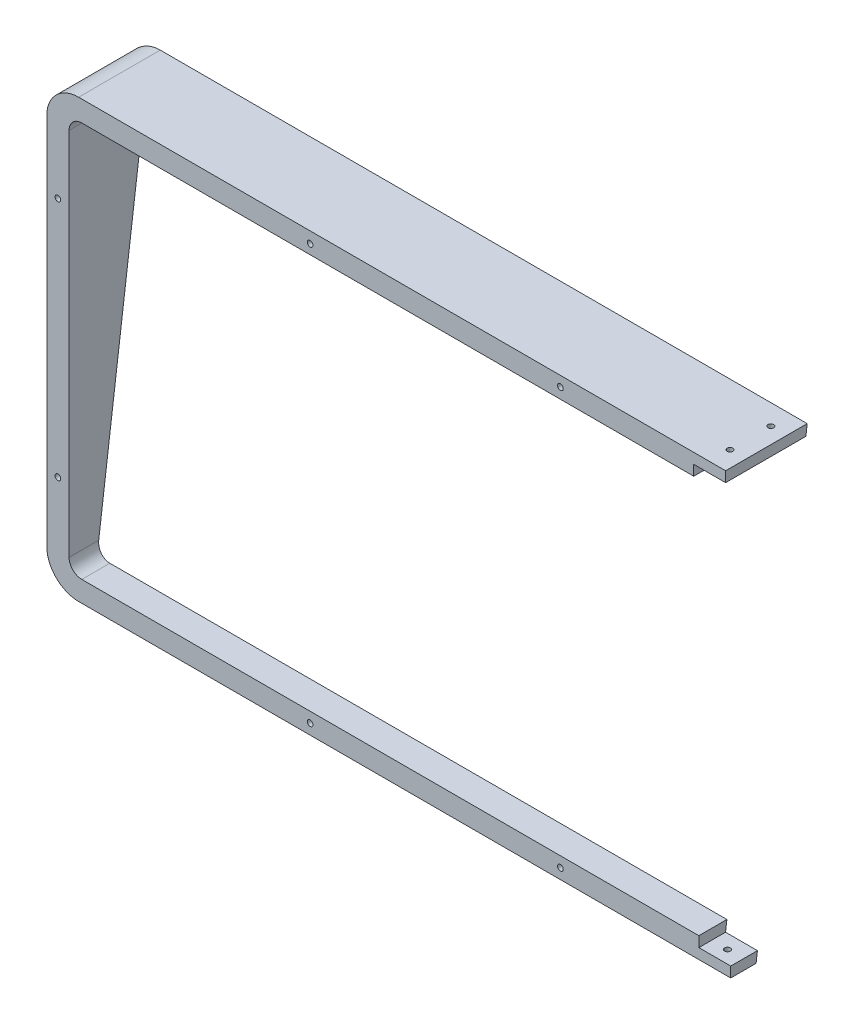
ISO-10303-21;
HEADER;
FILE_DESCRIPTION(('STEP AP214'),'2;1');
FILE_NAME('part.step','',(''),(''),'','','');
FILE_SCHEMA(('AUTOMOTIVE_DESIGN { 1 0 10303 214 1 1 1 1 }'));
ENDSEC;
DATA;
#1=APPLICATION_CONTEXT('core data for automotive mechanical design processes');
#2=APPLICATION_PROTOCOL_DEFINITION('international standard','automotive_design',2000,#1);
#3=PRODUCT_CONTEXT('',#1,'mechanical');
#4=PRODUCT('Part','Part','',(#3));
#5=PRODUCT_RELATED_PRODUCT_CATEGORY('part','',(#4));
#6=PRODUCT_DEFINITION_FORMATION('','',#4);
#7=PRODUCT_DEFINITION_CONTEXT('part definition',#1,'design');
#8=PRODUCT_DEFINITION('design','',#6,#7);
#9=PRODUCT_DEFINITION_SHAPE('','',#8);
#10=(LENGTH_UNIT() NAMED_UNIT(*) SI_UNIT(.MILLI.,.METRE.));
#11=(NAMED_UNIT(*) PLANE_ANGLE_UNIT() SI_UNIT($,.RADIAN.));
#12=(NAMED_UNIT(*) SI_UNIT($,.STERADIAN.) SOLID_ANGLE_UNIT());
#13=UNCERTAINTY_MEASURE_WITH_UNIT(LENGTH_MEASURE(1.E-05),#10,'distance_accuracy_value','');
#14=(GEOMETRIC_REPRESENTATION_CONTEXT(3) GLOBAL_UNCERTAINTY_ASSIGNED_CONTEXT((#13)) GLOBAL_UNIT_ASSIGNED_CONTEXT((#10,
#11,#12)) REPRESENTATION_CONTEXT('',''));
#15=CARTESIAN_POINT('',(0.,0.,0.));
#16=DIRECTION('',(0.,0.,1.));
#17=DIRECTION('',(1.,0.,0.));
#18=AXIS2_PLACEMENT_3D('',#15,#16,#17);
#19=CARTESIAN_POINT('',(221.699809919039,-32.9124999999699,-25.6100000004634));
#20=DIRECTION('',(0.,1.,0.));
#21=DIRECTION('',(0.,0.,1.));
#22=AXIS2_PLACEMENT_3D('',#19,#20,#21);
#23=PLANE('',#22);
#24=DIRECTION('',(1.,0.,0.));
#25=VECTOR('',#24,1.);
#26=CARTESIAN_POINT('',(1008.75625,-32.9124999999699,-25.181428383529));
#27=LINE('',#26,#25);
#28=CARTESIAN_POINT('',(211.699809919039,-32.9124999999699,-25.181428383529));
#29=VERTEX_POINT('',#28);
#30=CARTESIAN_POINT('',(221.699809919039,-32.9124999999699,-25.181428383529));
#31=VERTEX_POINT('',#30);
#32=EDGE_CURVE('E312',#29,#31,#27,.T.);
#33=ORIENTED_EDGE('',*,*,#32,.T.);
#34=DIRECTION('',(0.,0.,1.));
#35=VECTOR('',#34,1.);
#36=CARTESIAN_POINT('',(221.699809919039,-32.9124999999699,-25.6100000004634));
#37=LINE('',#36,#35);
#38=CARTESIAN_POINT('',(221.699809919039,-32.9124999999699,0.));
#39=VERTEX_POINT('',#38);
#40=EDGE_CURVE('E303',#31,#39,#37,.T.);
#41=ORIENTED_EDGE('',*,*,#40,.T.);
#42=DIRECTION('',(1.,0.,0.));
#43=VECTOR('',#42,1.);
#44=CARTESIAN_POINT('',(8.7462499999999,-32.9124999999699,0.));
#45=LINE('',#44,#43);
#46=CARTESIAN_POINT('',(211.699809919039,-32.9124999999699,0.));
#47=VERTEX_POINT('',#46);
#48=EDGE_CURVE('E330',#47,#39,#45,.T.);
#49=ORIENTED_EDGE('',*,*,#48,.F.);
#50=DIRECTION('',(0.,0.,1.));
#51=VECTOR('',#50,1.);
#52=CARTESIAN_POINT('',(211.699809919039,-32.9124999999699,-25.6100000004634));
#53=LINE('',#52,#51);
#54=EDGE_CURVE('E340',#29,#47,#53,.T.);
#55=ORIENTED_EDGE('',*,*,#54,.F.);
#56=EDGE_LOOP('',(#33,#41,#49,#55));
#57=FACE_BOUND('',#56,.T.);
#58=CARTESIAN_POINT('',(216.69375,-32.9124999999699,-19.2));
#59=DIRECTION('',(0.,1.,0.));
#60=DIRECTION('',(0.,0.,1.));
#61=AXIS2_PLACEMENT_3D('',#58,#59,#60);
#62=CIRCLE('',#61,0.889000000000001);
#63=CARTESIAN_POINT('',(216.69375,-32.9124999999699,-18.311));
#64=VERTEX_POINT('',#63);
#65=EDGE_CURVE('E295',#64,#64,#62,.F.);
#66=ORIENTED_EDGE('',*,*,#65,.F.);
#67=EDGE_LOOP('',(#66));
#68=FACE_BOUND('',#67,.T.);
#69=CARTESIAN_POINT('',(216.69375,-32.9124999999699,-6.4));
#70=DIRECTION('',(0.,1.,0.));
#71=DIRECTION('',(0.,0.,1.));
#72=AXIS2_PLACEMENT_3D('',#69,#70,#71);
#73=CIRCLE('',#72,0.889000000000001);
#74=CARTESIAN_POINT('',(216.69375,-32.9124999999699,-5.511));
#75=VERTEX_POINT('',#74);
#76=EDGE_CURVE('E300',#75,#75,#73,.F.);
#77=ORIENTED_EDGE('',*,*,#76,.F.);
#78=EDGE_LOOP('',(#77));
#79=FACE_BOUND('',#78,.T.);
#80=ADVANCED_FACE('F46',(#57,#68,#79),#23,.F.);
#81=CARTESIAN_POINT('',(221.699809919039,-27.3507461540696,-25.6100000004634));
#82=DIRECTION('',(-1.,0.,0.));
#83=DIRECTION('',(0.,0.,1.));
#84=AXIS2_PLACEMENT_3D('',#81,#82,#83);
#85=PLANE('',#84);
#86=DIRECTION('',(0.,0.,1.));
#87=VECTOR('',#86,1.);
#88=CARTESIAN_POINT('',(221.699809919039,-29.6624999999703,0.));
#89=LINE('',#88,#87);
#90=CARTESIAN_POINT('',(221.699809919039,-29.6624999999703,-25.6));
#91=VERTEX_POINT('',#90);
#92=CARTESIAN_POINT('',(221.699809919039,-29.6624999999703,0.));
#93=VERTEX_POINT('',#92);
#94=EDGE_CURVE('E50',#91,#93,#89,.T.);
#95=ORIENTED_EDGE('',*,*,#94,.T.);
#96=DIRECTION('',(0.,1.,0.));
#97=VECTOR('',#96,1.);
#98=CARTESIAN_POINT('',(221.699809919039,-181.504202820948,0.));
#99=LINE('',#98,#97);
#100=EDGE_CURVE('E333',#39,#93,#99,.T.);
#101=ORIENTED_EDGE('',*,*,#100,.F.);
#102=ORIENTED_EDGE('',*,*,#40,.F.);
#103=DIRECTION('',(0.,0.99180817463833,-0.127736231041094));
#104=VECTOR('',#103,1.);
#105=CARTESIAN_POINT('',(221.699809919039,-3.7272493642608,-28.9402337790932));
#106=LINE('',#105,#104);
#107=EDGE_CURVE('E72',#31,#91,#106,.T.);
#108=ORIENTED_EDGE('',*,*,#107,.T.);
#109=EDGE_LOOP('',(#95,#101,#102,#108));
#110=FACE_BOUND('',#109,.T.);
#111=ADVANCED_FACE('F48',(#110),#85,.F.);
#112=CARTESIAN_POINT('',(211.699809919039,-32.9124999999699,-25.6100000004634));
#113=DIRECTION('',(-1.,0.,0.));
#114=DIRECTION('',(0.,0.,1.));
#115=AXIS2_PLACEMENT_3D('',#112,#113,#114);
#116=PLANE('',#115);
#117=DIRECTION('',(0.,0.,-1.));
#118=VECTOR('',#117,1.);
#119=CARTESIAN_POINT('',(211.699809919039,-36.1625000000006,-25.6));
#120=LINE('',#119,#118);
#121=CARTESIAN_POINT('',(211.699809919039,-36.1625000000006,0.));
#122=VERTEX_POINT('',#121);
#123=CARTESIAN_POINT('',(211.699809919039,-36.1625000000006,-24.7628567670581));
#124=VERTEX_POINT('',#123);
#125=EDGE_CURVE('E359',#122,#124,#120,.T.);
#126=ORIENTED_EDGE('',*,*,#125,.T.);
#127=DIRECTION('',(0.,0.99180817463833,-0.127736231041094));
#128=VECTOR('',#127,1.);
#129=CARTESIAN_POINT('',(211.699809919039,-3.7272493642608,-28.9402337790932));
#130=LINE('',#129,#128);
#131=EDGE_CURVE('E308',#124,#29,#130,.T.);
#132=ORIENTED_EDGE('',*,*,#131,.T.);
#133=ORIENTED_EDGE('',*,*,#54,.T.);
#134=DIRECTION('',(0.,1.,0.));
#135=VECTOR('',#134,1.);
#136=CARTESIAN_POINT('',(211.699809919039,-181.504202820948,0.));
#137=LINE('',#136,#135);
#138=EDGE_CURVE('E326',#122,#47,#137,.T.);
#139=ORIENTED_EDGE('',*,*,#138,.F.);
#140=EDGE_LOOP('',(#126,#132,#133,#139));
#141=FACE_BOUND('',#140,.T.);
#142=ADVANCED_FACE('F426',(#141),#116,.F.);
#143=CARTESIAN_POINT('',(223.307280219127,-163.4125,-25.6100000004634));
#144=DIRECTION('',(-1.,0.,0.));
#145=DIRECTION('',(0.,0.,1.));
#146=AXIS2_PLACEMENT_3D('',#143,#144,#145);
#147=PLANE('',#146);
#148=DIRECTION('',(0.,0.,-1.));
#149=VECTOR('',#148,1.);
#150=CARTESIAN_POINT('',(223.307280219127,-166.6625,0.));
#151=LINE('',#150,#149);
#152=CARTESIAN_POINT('',(223.307280219127,-166.6625,0.));
#153=VERTEX_POINT('',#152);
#154=CARTESIAN_POINT('',(223.307280219126,-166.6625,-7.95559647507533));
#155=VERTEX_POINT('',#154);
#156=EDGE_CURVE('E315',#153,#155,#151,.T.);
#157=ORIENTED_EDGE('',*,*,#156,.T.);
#158=DIRECTION('',(0.,0.99180817463833,-0.127736231041094));
#159=VECTOR('',#158,1.);
#160=CARTESIAN_POINT('',(223.307280219126,-3.7272493642608,-28.9402337790932));
#161=LINE('',#160,#159);
#162=CARTESIAN_POINT('',(223.307280219126,-163.4125,-8.37416809154234));
#163=VERTEX_POINT('',#162);
#164=EDGE_CURVE('E64',#155,#163,#161,.T.);
#165=ORIENTED_EDGE('',*,*,#164,.T.);
#166=DIRECTION('',(0.,0.,1.));
#167=VECTOR('',#166,1.);
#168=CARTESIAN_POINT('',(223.307280219127,-163.4125,-25.6100000004634));
#169=LINE('',#168,#167);
#170=CARTESIAN_POINT('',(223.307280219127,-163.4125,0.));
#171=VERTEX_POINT('',#170);
#172=EDGE_CURVE('E12',#163,#171,#169,.T.);
#173=ORIENTED_EDGE('',*,*,#172,.T.);
#174=DIRECTION('',(0.,1.,0.));
#175=VECTOR('',#174,1.);
#176=CARTESIAN_POINT('',(223.307280219127,-181.504202820948,0.));
#177=LINE('',#176,#175);
#178=EDGE_CURVE('E316',#153,#171,#177,.T.);
#179=ORIENTED_EDGE('',*,*,#178,.F.);
#180=EDGE_LOOP('',(#157,#165,#173,#179));
#181=FACE_BOUND('',#180,.T.);
#182=ADVANCED_FACE('F484',(#181),#147,.F.);
#183=CARTESIAN_POINT('',(213.307280219127,-128.439696427491,-25.6100000004634));
#184=DIRECTION('',(-1.,0.,0.));
#185=DIRECTION('',(0.,0.,1.));
#186=AXIS2_PLACEMENT_3D('',#183,#184,#185);
#187=PLANE('',#186);
#188=DIRECTION('',(0.,0.,1.));
#189=VECTOR('',#188,1.);
#190=CARTESIAN_POINT('',(213.307280219127,-160.1625,-25.6));
#191=LINE('',#190,#189);
#192=CARTESIAN_POINT('',(213.307280219126,-160.1625,-8.79273970800934));
#193=VERTEX_POINT('',#192);
#194=CARTESIAN_POINT('',(213.307280219127,-160.1625,0.));
#195=VERTEX_POINT('',#194);
#196=EDGE_CURVE('E335',#193,#195,#191,.T.);
#197=ORIENTED_EDGE('',*,*,#196,.T.);
#198=DIRECTION('',(0.,1.,0.));
#199=VECTOR('',#198,1.);
#200=CARTESIAN_POINT('',(213.307280219127,-181.504202820948,0.));
#201=LINE('',#200,#199);
#202=CARTESIAN_POINT('',(213.307280219127,-163.4125,0.));
#203=VERTEX_POINT('',#202);
#204=EDGE_CURVE('E323',#203,#195,#201,.T.);
#205=ORIENTED_EDGE('',*,*,#204,.F.);
#206=DIRECTION('',(0.,0.,1.));
#207=VECTOR('',#206,1.);
#208=CARTESIAN_POINT('',(213.307280219127,-163.4125,-25.6100000004634));
#209=LINE('',#208,#207);
#210=CARTESIAN_POINT('',(213.307280219127,-163.4125,-8.37416809154234));
#211=VERTEX_POINT('',#210);
#212=EDGE_CURVE('E56',#211,#203,#209,.T.);
#213=ORIENTED_EDGE('',*,*,#212,.F.);
#214=DIRECTION('',(0.,0.99180817463833,-0.127736231041094));
#215=VECTOR('',#214,1.);
#216=CARTESIAN_POINT('',(213.307280219126,-3.7272493642608,-28.9402337790932));
#217=LINE('',#216,#215);
#218=EDGE_CURVE('E305',#211,#193,#217,.T.);
#219=ORIENTED_EDGE('',*,*,#218,.T.);
#220=EDGE_LOOP('',(#197,#205,#213,#219));
#221=FACE_BOUND('',#220,.T.);
#222=ADVANCED_FACE('F485',(#221),#187,.F.);
#223=CARTESIAN_POINT('',(213.307280219127,-163.4125,-25.6100000004634));
#224=DIRECTION('',(0.,-1.,0.));
#225=DIRECTION('',(0.,0.,-1.));
#226=AXIS2_PLACEMENT_3D('',#223,#224,#225);
#227=PLANE('',#226);
#228=DIRECTION('',(-1.,0.,0.));
#229=VECTOR('',#228,1.);
#230=CARTESIAN_POINT('',(1008.75625,-163.4125,-8.37416809154233));
#231=LINE('',#230,#229);
#232=EDGE_CURVE('E304',#163,#211,#231,.T.);
#233=ORIENTED_EDGE('',*,*,#232,.T.);
#234=ORIENTED_EDGE('',*,*,#212,.T.);
#235=DIRECTION('',(-1.,0.,0.));
#236=VECTOR('',#235,1.);
#237=CARTESIAN_POINT('',(8.7462499999999,-163.4125,0.));
#238=LINE('',#237,#236);
#239=EDGE_CURVE('E319',#171,#203,#238,.T.);
#240=ORIENTED_EDGE('',*,*,#239,.F.);
#241=ORIENTED_EDGE('',*,*,#172,.F.);
#242=EDGE_LOOP('',(#233,#234,#240,#241));
#243=FACE_BOUND('',#242,.T.);
#244=CARTESIAN_POINT('',(218.307280219127,-163.4125,-3.97779823753767));
#245=DIRECTION('',(0.,-1.,0.));
#246=DIRECTION('',(0.,0.,-1.));
#247=AXIS2_PLACEMENT_3D('',#244,#245,#246);
#248=CIRCLE('',#247,0.889000000000001);
#249=CARTESIAN_POINT('',(218.307280219127,-163.4125,-4.86679823753767));
#250=VERTEX_POINT('',#249);
#251=EDGE_CURVE('E291',#250,#250,#248,.F.);
#252=ORIENTED_EDGE('',*,*,#251,.F.);
#253=EDGE_LOOP('',(#252));
#254=FACE_BOUND('',#253,.T.);
#255=ADVANCED_FACE('F488',(#243,#254),#227,.F.);
#256=CARTESIAN_POINT('',(169.879428114565,-32.844620329947,-4.67));
#257=DIRECTION('',(0.,0.,1.));
#258=DIRECTION('',(1.,0.,0.));
#259=AXIS2_PLACEMENT_3D('',#256,#257,#258);
#260=CONICAL_SURFACE('',#259,0.889000000000001,1.02974425867666);
#261=CARTESIAN_POINT('',(169.879428114565,-32.844620329947,-5.20416509031549));
#262=VERTEX_POINT('',#261);
#263=VERTEX_LOOP('',#262);
#264=FACE_BOUND('',#263,.T.);
#265=CARTESIAN_POINT('',(169.879428114565,-32.844620329947,-4.67));
#266=DIRECTION('',(0.,0.,1.));
#267=DIRECTION('',(1.,0.,0.));
#268=AXIS2_PLACEMENT_3D('',#265,#266,#267);
#269=CIRCLE('',#268,0.889000000000001);
#270=CARTESIAN_POINT('',(170.768428114565,-32.844620329947,-4.67));
#271=VERTEX_POINT('',#270);
#272=EDGE_CURVE('E410',#271,#271,#269,.T.);
#273=ORIENTED_EDGE('',*,*,#272,.T.);
#274=EDGE_LOOP('',(#273));
#275=FACE_BOUND('',#274,.T.);
#276=ADVANCED_FACE('F492',(#264,#275),#260,.F.);
#277=CARTESIAN_POINT('',(12.2499790870042,-60.4171979564535,-4.67));
#278=DIRECTION('',(0.,0.,1.));
#279=DIRECTION('',(1.,0.,0.));
#280=AXIS2_PLACEMENT_3D('',#277,#278,#279);
#281=CONICAL_SURFACE('',#280,0.888999999999987,1.02974425867665);
#282=CARTESIAN_POINT('',(12.2499790870042,-60.4171979564535,-5.20416509031549));
#283=VERTEX_POINT('',#282);
#284=VERTEX_LOOP('',#283);
#285=FACE_BOUND('',#284,.T.);
#286=CARTESIAN_POINT('',(12.2499790870042,-60.4171979564535,-4.67));
#287=DIRECTION('',(0.,0.,1.));
#288=DIRECTION('',(1.,0.,0.));
#289=AXIS2_PLACEMENT_3D('',#286,#287,#288);
#290=CIRCLE('',#289,0.888999999999987);
#291=CARTESIAN_POINT('',(13.1389790870042,-60.4171979564535,-4.67));
#292=VERTEX_POINT('',#291);
#293=EDGE_CURVE('E402',#292,#292,#290,.T.);
#294=ORIENTED_EDGE('',*,*,#293,.T.);
#295=EDGE_LOOP('',(#294));
#296=FACE_BOUND('',#295,.T.);
#297=ADVANCED_FACE('F545',(#285,#296),#281,.F.);
#298=CARTESIAN_POINT('',(91.3575968195982,-163.4125,-4.67));
#299=DIRECTION('',(0.,0.,1.));
#300=DIRECTION('',(1.,0.,0.));
#301=AXIS2_PLACEMENT_3D('',#298,#299,#300);
#302=CONICAL_SURFACE('',#301,0.888999999999987,1.02974425867665);
#303=CARTESIAN_POINT('',(91.3575968195982,-163.4125,-5.20416509031549));
#304=VERTEX_POINT('',#303);
#305=VERTEX_LOOP('',#304);
#306=FACE_BOUND('',#305,.T.);
#307=CARTESIAN_POINT('',(91.3575968195982,-163.4125,-4.67));
#308=DIRECTION('',(0.,0.,1.));
#309=DIRECTION('',(1.,0.,0.));
#310=AXIS2_PLACEMENT_3D('',#307,#308,#309);
#311=CIRCLE('',#310,0.888999999999987);
#312=CARTESIAN_POINT('',(92.2465968195982,-163.4125,-4.67));
#313=VERTEX_POINT('',#312);
#314=EDGE_CURVE('E394',#313,#313,#311,.T.);
#315=ORIENTED_EDGE('',*,*,#314,.T.);
#316=EDGE_LOOP('',(#315));
#317=FACE_BOUND('',#316,.T.);
#318=ADVANCED_FACE('F537',(#306,#317),#302,.F.);
#319=CARTESIAN_POINT('',(169.879428114565,-163.4125,-4.67));
#320=DIRECTION('',(0.,0.,1.));
#321=DIRECTION('',(1.,0.,0.));
#322=AXIS2_PLACEMENT_3D('',#319,#320,#321);
#323=CONICAL_SURFACE('',#322,0.889000000000001,1.02974425867666);
#324=CARTESIAN_POINT('',(169.879428114565,-163.4125,-5.20416509031549));
#325=VERTEX_POINT('',#324);
#326=VERTEX_LOOP('',#325);
#327=FACE_BOUND('',#326,.T.);
#328=CARTESIAN_POINT('',(169.879428114565,-163.4125,-4.67));
#329=DIRECTION('',(0.,0.,1.));
#330=DIRECTION('',(1.,0.,0.));
#331=AXIS2_PLACEMENT_3D('',#328,#329,#330);
#332=CIRCLE('',#331,0.889000000000001);
#333=CARTESIAN_POINT('',(170.768428114565,-163.4125,-4.67));
#334=VERTEX_POINT('',#333);
#335=EDGE_CURVE('E390',#334,#334,#332,.T.);
#336=ORIENTED_EDGE('',*,*,#335,.T.);
#337=EDGE_LOOP('',(#336));
#338=FACE_BOUND('',#337,.T.);
#339=ADVANCED_FACE('F533',(#327,#338),#323,.F.);
#340=CARTESIAN_POINT('',(12.2499790870042,-136.153038312332,-4.67));
#341=DIRECTION('',(0.,0.,1.));
#342=DIRECTION('',(1.,0.,0.));
#343=AXIS2_PLACEMENT_3D('',#340,#341,#342);
#344=CONICAL_SURFACE('',#343,0.888999999999987,1.02974425867665);
#345=CARTESIAN_POINT('',(12.2499790870042,-136.153038312332,-5.20416509031549));
#346=VERTEX_POINT('',#345);
#347=VERTEX_LOOP('',#346);
#348=FACE_BOUND('',#347,.T.);
#349=CARTESIAN_POINT('',(12.2499790870042,-136.153038312332,-4.67));
#350=DIRECTION('',(0.,0.,1.));
#351=DIRECTION('',(1.,0.,0.));
#352=AXIS2_PLACEMENT_3D('',#349,#350,#351);
#353=CIRCLE('',#352,0.888999999999987);
#354=CARTESIAN_POINT('',(13.1389790870042,-136.153038312332,-4.67));
#355=VERTEX_POINT('',#354);
#356=EDGE_CURVE('E398',#355,#355,#353,.T.);
#357=ORIENTED_EDGE('',*,*,#356,.T.);
#358=EDGE_LOOP('',(#357));
#359=FACE_BOUND('',#358,.T.);
#360=ADVANCED_FACE('F536',(#348,#359),#344,.F.);
#361=CARTESIAN_POINT('',(91.3575968195982,-33.1714533837719,-4.67));
#362=DIRECTION('',(0.,0.,1.));
#363=DIRECTION('',(1.,0.,0.));
#364=AXIS2_PLACEMENT_3D('',#361,#362,#363);
#365=CONICAL_SURFACE('',#364,0.888999999999987,1.02974425867665);
#366=CARTESIAN_POINT('',(91.3575968195982,-33.1714533837719,-5.20416509031549));
#367=VERTEX_POINT('',#366);
#368=VERTEX_LOOP('',#367);
#369=FACE_BOUND('',#368,.T.);
#370=CARTESIAN_POINT('',(91.3575968195982,-33.1714533837719,-4.67));
#371=DIRECTION('',(0.,0.,1.));
#372=DIRECTION('',(1.,0.,0.));
#373=AXIS2_PLACEMENT_3D('',#370,#371,#372);
#374=CIRCLE('',#373,0.888999999999987);
#375=CARTESIAN_POINT('',(92.2465968195982,-33.1714533837719,-4.67));
#376=VERTEX_POINT('',#375);
#377=EDGE_CURVE('E406',#376,#376,#374,.T.);
#378=ORIENTED_EDGE('',*,*,#377,.T.);
#379=EDGE_LOOP('',(#378));
#380=FACE_BOUND('',#379,.T.);
#381=ADVANCED_FACE('F552',(#369,#380),#365,.F.);
#382=CARTESIAN_POINT('',(169.879428114565,-32.844620329947,1.56));
#383=DIRECTION('',(0.,0.,1.));
#384=DIRECTION('',(1.,0.,0.));
#385=AXIS2_PLACEMENT_3D('',#382,#383,#384);
#386=CYLINDRICAL_SURFACE('',#385,0.889000000000001);
#387=CARTESIAN_POINT('',(169.879428114565,-32.844620329947,0.));
#388=DIRECTION('',(0.,0.,-1.));
#389=DIRECTION('',(-1.,0.,0.));
#390=AXIS2_PLACEMENT_3D('',#387,#388,#389);
#391=CIRCLE('',#390,0.889000000000001);
#392=CARTESIAN_POINT('',(168.990428114565,-32.844620329947,0.));
#393=VERTEX_POINT('',#392);
#394=EDGE_CURVE('E257',#393,#393,#391,.F.);
#395=ORIENTED_EDGE('',*,*,#394,.T.);
#396=EDGE_LOOP('',(#395));
#397=FACE_BOUND('',#396,.T.);
#398=ORIENTED_EDGE('',*,*,#272,.F.);
#399=EDGE_LOOP('',(#398));
#400=FACE_BOUND('',#399,.T.);
#401=ADVANCED_FACE('F556',(#397,#400),#386,.F.);
#402=CARTESIAN_POINT('',(12.2499790870042,-60.4171979564535,1.56));
#403=DIRECTION('',(0.,0.,1.));
#404=DIRECTION('',(1.,0.,0.));
#405=AXIS2_PLACEMENT_3D('',#402,#403,#404);
#406=CYLINDRICAL_SURFACE('',#405,0.888999999999988);
#407=CARTESIAN_POINT('',(12.2499790870042,-60.4171979564535,0.));
#408=DIRECTION('',(0.,0.,-1.));
#409=DIRECTION('',(-1.,0.,0.));
#410=AXIS2_PLACEMENT_3D('',#407,#408,#409);
#411=CIRCLE('',#410,0.888999999999988);
#412=CARTESIAN_POINT('',(11.3609790870042,-60.4171979564535,0.));
#413=VERTEX_POINT('',#412);
#414=EDGE_CURVE('E280',#413,#413,#411,.F.);
#415=ORIENTED_EDGE('',*,*,#414,.T.);
#416=EDGE_LOOP('',(#415));
#417=FACE_BOUND('',#416,.T.);
#418=ORIENTED_EDGE('',*,*,#293,.F.);
#419=EDGE_LOOP('',(#418));
#420=FACE_BOUND('',#419,.T.);
#421=ADVANCED_FACE('F541',(#417,#420),#406,.F.);
#422=CARTESIAN_POINT('',(91.3575968195982,-163.4125,1.56));
#423=DIRECTION('',(0.,0.,1.));
#424=DIRECTION('',(1.,0.,0.));
#425=AXIS2_PLACEMENT_3D('',#422,#423,#424);
#426=CYLINDRICAL_SURFACE('',#425,0.888999999999987);
#427=CARTESIAN_POINT('',(91.3575968195982,-163.4125,0.));
#428=DIRECTION('',(0.,0.,-1.));
#429=DIRECTION('',(-1.,0.,0.));
#430=AXIS2_PLACEMENT_3D('',#427,#428,#429);
#431=CIRCLE('',#430,0.888999999999987);
#432=CARTESIAN_POINT('',(90.4685968195982,-163.4125,0.));
#433=VERTEX_POINT('',#432);
#434=EDGE_CURVE('E272',#433,#433,#431,.F.);
#435=ORIENTED_EDGE('',*,*,#434,.T.);
#436=EDGE_LOOP('',(#435));
#437=FACE_BOUND('',#436,.T.);
#438=ORIENTED_EDGE('',*,*,#314,.F.);
#439=EDGE_LOOP('',(#438));
#440=FACE_BOUND('',#439,.T.);
#441=ADVANCED_FACE('F531',(#437,#440),#426,.F.);
#442=CARTESIAN_POINT('',(169.879428114565,-163.4125,1.56));
#443=DIRECTION('',(0.,0.,1.));
#444=DIRECTION('',(1.,0.,0.));
#445=AXIS2_PLACEMENT_3D('',#442,#443,#444);
#446=CYLINDRICAL_SURFACE('',#445,0.889000000000001);
#447=CARTESIAN_POINT('',(169.879428114565,-163.4125,0.));
#448=DIRECTION('',(0.,0.,-1.));
#449=DIRECTION('',(-1.,0.,0.));
#450=AXIS2_PLACEMENT_3D('',#447,#448,#449);
#451=CIRCLE('',#450,0.889000000000001);
#452=CARTESIAN_POINT('',(168.990428114565,-163.4125,0.));
#453=VERTEX_POINT('',#452);
#454=EDGE_CURVE('E252',#453,#453,#451,.F.);
#455=ORIENTED_EDGE('',*,*,#454,.T.);
#456=EDGE_LOOP('',(#455));
#457=FACE_BOUND('',#456,.T.);
#458=ORIENTED_EDGE('',*,*,#335,.F.);
#459=EDGE_LOOP('',(#458));
#460=FACE_BOUND('',#459,.T.);
#461=ADVANCED_FACE('F527',(#457,#460),#446,.F.);
#462=CARTESIAN_POINT('',(12.2499790870042,-136.153038312332,1.56));
#463=DIRECTION('',(0.,0.,1.));
#464=DIRECTION('',(1.,0.,0.));
#465=AXIS2_PLACEMENT_3D('',#462,#463,#464);
#466=CYLINDRICAL_SURFACE('',#465,0.888999999999988);
#467=CARTESIAN_POINT('',(12.2499790870042,-136.153038312332,0.));
#468=DIRECTION('',(0.,0.,-1.));
#469=DIRECTION('',(-1.,0.,0.));
#470=AXIS2_PLACEMENT_3D('',#467,#468,#469);
#471=CIRCLE('',#470,0.888999999999988);
#472=CARTESIAN_POINT('',(11.3609790870042,-136.153038312332,0.));
#473=VERTEX_POINT('',#472);
#474=EDGE_CURVE('E276',#473,#473,#471,.F.);
#475=ORIENTED_EDGE('',*,*,#474,.T.);
#476=EDGE_LOOP('',(#475));
#477=FACE_BOUND('',#476,.T.);
#478=ORIENTED_EDGE('',*,*,#356,.F.);
#479=EDGE_LOOP('',(#478));
#480=FACE_BOUND('',#479,.T.);
#481=ADVANCED_FACE('F530',(#477,#480),#466,.F.);
#482=CARTESIAN_POINT('',(91.3575968195982,-33.1714533837719,1.56));
#483=DIRECTION('',(0.,0.,1.));
#484=DIRECTION('',(1.,0.,0.));
#485=AXIS2_PLACEMENT_3D('',#482,#483,#484);
#486=CYLINDRICAL_SURFACE('',#485,0.888999999999987);
#487=CARTESIAN_POINT('',(91.3575968195982,-33.1714533837719,0.));
#488=DIRECTION('',(0.,0.,-1.));
#489=DIRECTION('',(-1.,0.,0.));
#490=AXIS2_PLACEMENT_3D('',#487,#488,#489);
#491=CIRCLE('',#490,0.888999999999987);
#492=CARTESIAN_POINT('',(90.4685968195982,-33.1714533837719,0.));
#493=VERTEX_POINT('',#492);
#494=EDGE_CURVE('E284',#493,#493,#491,.F.);
#495=ORIENTED_EDGE('',*,*,#494,.T.);
#496=EDGE_LOOP('',(#495));
#497=FACE_BOUND('',#496,.T.);
#498=ORIENTED_EDGE('',*,*,#377,.F.);
#499=EDGE_LOOP('',(#498));
#500=FACE_BOUND('',#499,.T.);
#501=ADVANCED_FACE('F499',(#497,#500),#486,.F.);
#502=CARTESIAN_POINT('',(8.7462499999999,-181.504202820948,0.));
#503=DIRECTION('',(0.,0.,-1.));
#504=DIRECTION('',(-1.,0.,0.));
#505=AXIS2_PLACEMENT_3D('',#502,#503,#504);
#506=PLANE('',#505);
#507=ORIENTED_EDGE('',*,*,#494,.F.);
#508=EDGE_LOOP('',(#507));
#509=FACE_BOUND('',#508,.T.);
#510=ORIENTED_EDGE('',*,*,#474,.F.);
#511=EDGE_LOOP('',(#510));
#512=FACE_BOUND('',#511,.T.);
#513=ORIENTED_EDGE('',*,*,#454,.F.);
#514=EDGE_LOOP('',(#513));
#515=FACE_BOUND('',#514,.T.);
#516=ORIENTED_EDGE('',*,*,#48,.T.);
#517=ORIENTED_EDGE('',*,*,#100,.T.);
#518=DIRECTION('',(-1.,1.53815466356559E-13,0.));
#519=VECTOR('',#518,1.);
#520=CARTESIAN_POINT('',(-4.56256288432815E-12,-29.6624999999362,0.));
#521=LINE('',#520,#519);
#522=CARTESIAN_POINT('',(18.7562500000015,-29.6624999999391,0.));
#523=VERTEX_POINT('',#522);
#524=EDGE_CURVE('E253',#93,#523,#521,.T.);
#525=ORIENTED_EDGE('',*,*,#524,.T.);
#526=CARTESIAN_POINT('',(18.75625,-39.6624999999391,0.));
#527=DIRECTION('',(0.,0.,-1.));
#528=DIRECTION('',(-1.,0.,0.));
#529=AXIS2_PLACEMENT_3D('',#526,#527,#528);
#530=CIRCLE('',#529,10.);
#531=CARTESIAN_POINT('',(8.75624999999999,-39.6624999999391,0.));
#532=VERTEX_POINT('',#531);
#533=EDGE_CURVE('E245',#523,#532,#530,.F.);
#534=ORIENTED_EDGE('',*,*,#533,.T.);
#535=DIRECTION('',(0.,-1.,0.));
#536=VECTOR('',#535,1.);
#537=CARTESIAN_POINT('',(8.75624999999998,0.,0.));
#538=LINE('',#537,#536);
#539=CARTESIAN_POINT('',(8.75625,-156.6625,0.));
#540=VERTEX_POINT('',#539);
#541=EDGE_CURVE('E256',#532,#540,#538,.T.);
#542=ORIENTED_EDGE('',*,*,#541,.T.);
#543=CARTESIAN_POINT('',(18.75625,-156.6625,0.));
#544=DIRECTION('',(0.,0.,-1.));
#545=DIRECTION('',(-1.,0.,0.));
#546=AXIS2_PLACEMENT_3D('',#543,#544,#545);
#547=CIRCLE('',#546,10.);
#548=CARTESIAN_POINT('',(18.75625,-166.6625,0.));
#549=VERTEX_POINT('',#548);
#550=EDGE_CURVE('E207',#540,#549,#547,.F.);
#551=ORIENTED_EDGE('',*,*,#550,.T.);
#552=DIRECTION('',(1.,0.,0.));
#553=VECTOR('',#552,1.);
#554=CARTESIAN_POINT('',(0.,-166.6625,0.));
#555=LINE('',#554,#553);
#556=EDGE_CURVE('E263',#549,#153,#555,.T.);
#557=ORIENTED_EDGE('',*,*,#556,.T.);
#558=ORIENTED_EDGE('',*,*,#178,.T.);
#559=ORIENTED_EDGE('',*,*,#239,.T.);
#560=ORIENTED_EDGE('',*,*,#204,.T.);
#561=DIRECTION('',(-1.,0.,0.));
#562=VECTOR('',#561,1.);
#563=CARTESIAN_POINT('',(15.7437081740084,-160.1625,0.));
#564=LINE('',#563,#562);
#565=CARTESIAN_POINT('',(19.7437081740084,-160.1625,0.));
#566=VERTEX_POINT('',#565);
#567=EDGE_CURVE('E296',#195,#566,#564,.T.);
#568=ORIENTED_EDGE('',*,*,#567,.T.);
#569=CARTESIAN_POINT('',(19.7437081740084,-156.1625,0.));
#570=DIRECTION('',(0.,0.,1.));
#571=DIRECTION('',(1.,0.,0.));
#572=AXIS2_PLACEMENT_3D('',#569,#570,#571);
#573=CIRCLE('',#572,4.);
#574=CARTESIAN_POINT('',(15.7437081740084,-156.1625,0.));
#575=VERTEX_POINT('',#574);
#576=EDGE_CURVE('E228',#566,#575,#573,.F.);
#577=ORIENTED_EDGE('',*,*,#576,.T.);
#578=DIRECTION('',(0.,1.,0.));
#579=VECTOR('',#578,1.);
#580=CARTESIAN_POINT('',(15.7437081740084,-36.1625000000006,0.));
#581=LINE('',#580,#579);
#582=CARTESIAN_POINT('',(15.7437081740084,-40.1625000000006,0.));
#583=VERTEX_POINT('',#582);
#584=EDGE_CURVE('E416',#575,#583,#581,.T.);
#585=ORIENTED_EDGE('',*,*,#584,.T.);
#586=CARTESIAN_POINT('',(19.7437081740084,-40.1625000000006,0.));
#587=DIRECTION('',(0.,0.,1.));
#588=DIRECTION('',(1.,0.,0.));
#589=AXIS2_PLACEMENT_3D('',#586,#587,#588);
#590=CIRCLE('',#589,4.);
#591=CARTESIAN_POINT('',(19.7437081740084,-36.1625000000006,0.));
#592=VERTEX_POINT('',#591);
#593=EDGE_CURVE('E233',#583,#592,#590,.F.);
#594=ORIENTED_EDGE('',*,*,#593,.T.);
#595=DIRECTION('',(1.,0.,0.));
#596=VECTOR('',#595,1.);
#597=CARTESIAN_POINT('',(412.268708174008,-36.1625000000006,0.));
#598=LINE('',#597,#596);
#599=EDGE_CURVE('E232',#592,#122,#598,.T.);
#600=ORIENTED_EDGE('',*,*,#599,.T.);
#601=ORIENTED_EDGE('',*,*,#138,.T.);
#602=EDGE_LOOP('',(#516,#517,#525,#534,#542,#551,#557,#558,#559,#560,#568,#577,#585,#594,#600,#601));
#603=FACE_BOUND('',#602,.T.);
#604=ORIENTED_EDGE('',*,*,#434,.F.);
#605=EDGE_LOOP('',(#604));
#606=FACE_BOUND('',#605,.T.);
#607=ORIENTED_EDGE('',*,*,#414,.F.);
#608=EDGE_LOOP('',(#607));
#609=FACE_BOUND('',#608,.T.);
#610=ORIENTED_EDGE('',*,*,#394,.F.);
#611=EDGE_LOOP('',(#610));
#612=FACE_BOUND('',#611,.T.);
#613=ADVANCED_FACE('F376',(#509,#512,#515,#603,#606,#609,#612),#506,.F.);
#614=CARTESIAN_POINT('',(-4.56256288432815E-12,-29.6624999999362,0.));
#615=DIRECTION('',(1.53815466356559E-13,1.,0.));
#616=DIRECTION('',(-1.,1.53815466356559E-13,0.));
#617=AXIS2_PLACEMENT_3D('',#614,#615,#616);
#618=PLANE('',#617);
#619=ORIENTED_EDGE('',*,*,#94,.F.);
#620=DIRECTION('',(1.,-1.53815466356559E-13,0.));
#621=VECTOR('',#620,1.);
#622=CARTESIAN_POINT('',(8.75625000000053,-29.6624999999376,-25.6));
#623=LINE('',#622,#621);
#624=CARTESIAN_POINT('',(18.75625,-29.6624999999391,-25.6));
#625=VERTEX_POINT('',#624);
#626=EDGE_CURVE('E217',#625,#91,#623,.T.);
#627=ORIENTED_EDGE('',*,*,#626,.F.);
#628=DIRECTION('',(0.,0.,1.));
#629=VECTOR('',#628,1.);
#630=CARTESIAN_POINT('',(18.7562500000015,-29.6624999999391,0.));
#631=LINE('',#630,#629);
#632=EDGE_CURVE('E210',#625,#523,#631,.T.);
#633=ORIENTED_EDGE('',*,*,#632,.T.);
#634=ORIENTED_EDGE('',*,*,#524,.F.);
#635=EDGE_LOOP('',(#619,#627,#633,#634));
#636=FACE_BOUND('',#635,.T.);
#637=CARTESIAN_POINT('',(216.69375,-29.6624999999695,-19.2));
#638=DIRECTION('',(0.,1.,0.));
#639=DIRECTION('',(0.,0.,1.));
#640=AXIS2_PLACEMENT_3D('',#637,#638,#639);
#641=CIRCLE('',#640,0.889000000000001);
#642=CARTESIAN_POINT('',(216.69375,-29.6624999999695,-18.311));
#643=VERTEX_POINT('',#642);
#644=EDGE_CURVE('E451',#643,#643,#641,.T.);
#645=ORIENTED_EDGE('',*,*,#644,.F.);
#646=EDGE_LOOP('',(#645));
#647=FACE_BOUND('',#646,.T.);
#648=CARTESIAN_POINT('',(216.69375,-29.6624999999695,-6.4));
#649=DIRECTION('',(0.,1.,0.));
#650=DIRECTION('',(0.,0.,1.));
#651=AXIS2_PLACEMENT_3D('',#648,#649,#650);
#652=CIRCLE('',#651,0.889000000000001);
#653=CARTESIAN_POINT('',(216.69375,-29.6624999999695,-5.511));
#654=VERTEX_POINT('',#653);
#655=EDGE_CURVE('E203',#654,#654,#652,.T.);
#656=ORIENTED_EDGE('',*,*,#655,.F.);
#657=EDGE_LOOP('',(#656));
#658=FACE_BOUND('',#657,.T.);
#659=ADVANCED_FACE('F371',(#636,#647,#658),#618,.T.);
#660=CARTESIAN_POINT('',(216.69375,-29.6624999999695,-19.2));
#661=DIRECTION('',(0.,1.,0.));
#662=DIRECTION('',(0.,0.,1.));
#663=AXIS2_PLACEMENT_3D('',#660,#661,#662);
#664=CYLINDRICAL_SURFACE('',#663,0.889000000000001);
#665=ORIENTED_EDGE('',*,*,#65,.T.);
#666=EDGE_LOOP('',(#665));
#667=FACE_BOUND('',#666,.T.);
#668=ORIENTED_EDGE('',*,*,#644,.T.);
#669=EDGE_LOOP('',(#668));
#670=FACE_BOUND('',#669,.T.);
#671=ADVANCED_FACE('F512',(#667,#670),#664,.F.);
#672=CARTESIAN_POINT('',(216.69375,-29.6624999999695,-6.4));
#673=DIRECTION('',(0.,1.,0.));
#674=DIRECTION('',(0.,0.,1.));
#675=AXIS2_PLACEMENT_3D('',#672,#673,#674);
#676=CYLINDRICAL_SURFACE('',#675,0.889000000000001);
#677=ORIENTED_EDGE('',*,*,#76,.T.);
#678=EDGE_LOOP('',(#677));
#679=FACE_BOUND('',#678,.T.);
#680=ORIENTED_EDGE('',*,*,#655,.T.);
#681=EDGE_LOOP('',(#680));
#682=FACE_BOUND('',#681,.T.);
#683=ADVANCED_FACE('F508',(#679,#682),#676,.F.);
#684=CARTESIAN_POINT('',(18.75625,-39.6624999999391,0.));
#685=DIRECTION('',(0.,0.,1.));
#686=DIRECTION('',(1.,0.,0.));
#687=AXIS2_PLACEMENT_3D('',#684,#685,#686);
#688=CYLINDRICAL_SURFACE('',#687,10.);
#689=ORIENTED_EDGE('',*,*,#533,.F.);
#690=ORIENTED_EDGE('',*,*,#632,.F.);
#691=CARTESIAN_POINT('',(18.75625,-39.6624999999391,-24.3120873339477));
#692=DIRECTION('',(0.,-0.127736231041094,-0.99180817463833));
#693=DIRECTION('',(0.,-0.99180817463833,0.127736231041094));
#694=AXIS2_PLACEMENT_3D('',#691,#692,#693);
#695=ELLIPSE('',#694,10.0825948562549,10.);
#696=CARTESIAN_POINT('',(8.75624999999999,-39.6624999999391,-24.3120873339477));
#697=VERTEX_POINT('',#696);
#698=EDGE_CURVE('E193',#625,#697,#695,.F.);
#699=ORIENTED_EDGE('',*,*,#698,.T.);
#700=DIRECTION('',(0.,0.,1.));
#701=VECTOR('',#700,1.);
#702=CARTESIAN_POINT('',(8.75624999999999,-39.6624999999391,0.));
#703=LINE('',#702,#701);
#704=EDGE_CURVE('E200',#532,#697,#703,.F.);
#705=ORIENTED_EDGE('',*,*,#704,.F.);
#706=EDGE_LOOP('',(#689,#690,#699,#705));
#707=FACE_BOUND('',#706,.T.);
#708=ADVANCED_FACE('F379',(#707),#688,.T.);
#709=CARTESIAN_POINT('',(8.75624999999998,0.,0.));
#710=DIRECTION('',(-1.,0.,0.));
#711=DIRECTION('',(0.,-1.,0.));
#712=AXIS2_PLACEMENT_3D('',#709,#710,#711);
#713=PLANE('',#712);
#714=ORIENTED_EDGE('',*,*,#541,.F.);
#715=ORIENTED_EDGE('',*,*,#704,.T.);
#716=DIRECTION('',(0.,-0.99180817463833,0.127736231041094));
#717=VECTOR('',#716,1.);
#718=CARTESIAN_POINT('',(8.75624999999998,-3.72724936426093,-28.9402337790932));
#719=LINE('',#718,#717);
#720=CARTESIAN_POINT('',(8.75625,-156.6625,-9.24350914112765));
#721=VERTEX_POINT('',#720);
#722=EDGE_CURVE('E185',#697,#721,#719,.T.);
#723=ORIENTED_EDGE('',*,*,#722,.T.);
#724=DIRECTION('',(0.,0.,-1.));
#725=VECTOR('',#724,1.);
#726=CARTESIAN_POINT('',(8.75625,-156.6625,0.));
#727=LINE('',#726,#725);
#728=EDGE_CURVE('E198',#721,#540,#727,.F.);
#729=ORIENTED_EDGE('',*,*,#728,.T.);
#730=EDGE_LOOP('',(#714,#715,#723,#729));
#731=FACE_BOUND('',#730,.T.);
#732=ADVANCED_FACE('F197',(#731),#713,.T.);
#733=CARTESIAN_POINT('',(18.75625,-156.6625,0.));
#734=DIRECTION('',(0.,0.,-1.));
#735=DIRECTION('',(-1.,0.,0.));
#736=AXIS2_PLACEMENT_3D('',#733,#734,#735);
#737=CYLINDRICAL_SURFACE('',#736,10.);
#738=ORIENTED_EDGE('',*,*,#550,.F.);
#739=ORIENTED_EDGE('',*,*,#728,.F.);
#740=CARTESIAN_POINT('',(18.75625,-156.6625,-9.24350914112766));
#741=DIRECTION('',(0.,-0.127736231041094,-0.99180817463833));
#742=DIRECTION('',(0.,0.99180817463833,-0.127736231041094));
#743=AXIS2_PLACEMENT_3D('',#740,#741,#742);
#744=ELLIPSE('',#743,10.0825948562549,10.);
#745=CARTESIAN_POINT('',(18.75625,-166.6625,-7.95559647507534));
#746=VERTEX_POINT('',#745);
#747=EDGE_CURVE('E182',#721,#746,#744,.F.);
#748=ORIENTED_EDGE('',*,*,#747,.T.);
#749=DIRECTION('',(0.,0.,-1.));
#750=VECTOR('',#749,1.);
#751=CARTESIAN_POINT('',(18.75625,-166.6625,0.));
#752=LINE('',#751,#750);
#753=EDGE_CURVE('E211',#549,#746,#752,.T.);
#754=ORIENTED_EDGE('',*,*,#753,.F.);
#755=EDGE_LOOP('',(#738,#739,#748,#754));
#756=FACE_BOUND('',#755,.T.);
#757=ADVANCED_FACE('F205',(#756),#737,.T.);
#758=CARTESIAN_POINT('',(0.,-166.6625,0.));
#759=DIRECTION('',(0.,-1.,0.));
#760=DIRECTION('',(0.,0.,-1.));
#761=AXIS2_PLACEMENT_3D('',#758,#759,#760);
#762=PLANE('',#761);
#763=ORIENTED_EDGE('',*,*,#156,.F.);
#764=ORIENTED_EDGE('',*,*,#556,.F.);
#765=ORIENTED_EDGE('',*,*,#753,.T.);
#766=DIRECTION('',(1.,0.,0.));
#767=VECTOR('',#766,1.);
#768=CARTESIAN_POINT('',(0.,-166.6625,-7.95559647507534));
#769=LINE('',#768,#767);
#770=EDGE_CURVE('E188',#746,#155,#769,.T.);
#771=ORIENTED_EDGE('',*,*,#770,.T.);
#772=EDGE_LOOP('',(#763,#764,#765,#771));
#773=FACE_BOUND('',#772,.T.);
#774=CARTESIAN_POINT('',(218.307280219127,-166.6625,-3.97779823753767));
#775=DIRECTION('',(0.,-1.,0.));
#776=DIRECTION('',(0.,0.,-1.));
#777=AXIS2_PLACEMENT_3D('',#774,#775,#776);
#778=CIRCLE('',#777,0.889000000000001);
#779=CARTESIAN_POINT('',(218.307280219127,-166.6625,-4.86679823753767));
#780=VERTEX_POINT('',#779);
#781=EDGE_CURVE('E455',#780,#780,#778,.T.);
#782=ORIENTED_EDGE('',*,*,#781,.F.);
#783=EDGE_LOOP('',(#782));
#784=FACE_BOUND('',#783,.T.);
#785=ADVANCED_FACE('F462',(#773,#784),#762,.T.);
#786=CARTESIAN_POINT('',(218.307280219127,-166.6625,-3.97779823753767));
#787=DIRECTION('',(0.,-1.,0.));
#788=DIRECTION('',(0.,0.,-1.));
#789=AXIS2_PLACEMENT_3D('',#786,#787,#788);
#790=CYLINDRICAL_SURFACE('',#789,0.889000000000001);
#791=ORIENTED_EDGE('',*,*,#251,.T.);
#792=EDGE_LOOP('',(#791));
#793=FACE_BOUND('',#792,.T.);
#794=ORIENTED_EDGE('',*,*,#781,.T.);
#795=EDGE_LOOP('',(#794));
#796=FACE_BOUND('',#795,.T.);
#797=ADVANCED_FACE('F460',(#793,#796),#790,.F.);
#798=CARTESIAN_POINT('',(15.7437081740084,-160.1625,-25.6));
#799=DIRECTION('',(0.,1.,0.));
#800=DIRECTION('',(0.,0.,1.));
#801=AXIS2_PLACEMENT_3D('',#798,#799,#800);
#802=PLANE('',#801);
#803=ORIENTED_EDGE('',*,*,#196,.F.);
#804=DIRECTION('',(-1.,0.,0.));
#805=VECTOR('',#804,1.);
#806=CARTESIAN_POINT('',(15.7437081740084,-160.1625,-8.79273970800934));
#807=LINE('',#806,#805);
#808=CARTESIAN_POINT('',(19.7437081740084,-160.1625,-8.79273970800934));
#809=VERTEX_POINT('',#808);
#810=EDGE_CURVE('E381',#193,#809,#807,.T.);
#811=ORIENTED_EDGE('',*,*,#810,.T.);
#812=DIRECTION('',(0.,0.,1.));
#813=VECTOR('',#812,1.);
#814=CARTESIAN_POINT('',(19.7437081740084,-160.1625,0.));
#815=LINE('',#814,#813);
#816=EDGE_CURVE('E223',#809,#566,#815,.T.);
#817=ORIENTED_EDGE('',*,*,#816,.T.);
#818=ORIENTED_EDGE('',*,*,#567,.F.);
#819=EDGE_LOOP('',(#803,#811,#817,#818));
#820=FACE_BOUND('',#819,.T.);
#821=ADVANCED_FACE('F470',(#820),#802,.T.);
#822=CARTESIAN_POINT('',(19.7437081740084,-156.1625,-25.6));
#823=DIRECTION('',(0.,0.,-1.));
#824=DIRECTION('',(-1.,0.,0.));
#825=AXIS2_PLACEMENT_3D('',#822,#823,#824);
#826=CYLINDRICAL_SURFACE('',#825,4.);
#827=CARTESIAN_POINT('',(19.7437081740084,-156.1625,-9.30790477443027));
#828=DIRECTION('',(0.,-0.127736231041094,-0.99180817463833));
#829=DIRECTION('',(0.,0.99180817463833,-0.127736231041094));
#830=AXIS2_PLACEMENT_3D('',#827,#828,#829);
#831=ELLIPSE('',#830,4.03303794250196,4.);
#832=CARTESIAN_POINT('',(15.7437081740084,-156.1625,-9.30790477443027));
#833=VERTEX_POINT('',#832);
#834=EDGE_CURVE('E384',#833,#809,#831,.F.);
#835=ORIENTED_EDGE('',*,*,#834,.F.);
#836=DIRECTION('',(0.,0.,1.));
#837=VECTOR('',#836,1.);
#838=CARTESIAN_POINT('',(15.7437081740084,-156.1625,-25.6));
#839=LINE('',#838,#837);
#840=EDGE_CURVE('E227',#575,#833,#839,.F.);
#841=ORIENTED_EDGE('',*,*,#840,.F.);
#842=ORIENTED_EDGE('',*,*,#576,.F.);
#843=ORIENTED_EDGE('',*,*,#816,.F.);
#844=EDGE_LOOP('',(#835,#841,#842,#843));
#845=FACE_BOUND('',#844,.T.);
#846=ADVANCED_FACE('F503',(#845),#826,.F.);
#847=CARTESIAN_POINT('',(15.7437081740084,-36.1625000000006,-25.6));
#848=DIRECTION('',(1.,0.,0.));
#849=DIRECTION('',(0.,1.,0.));
#850=AXIS2_PLACEMENT_3D('',#847,#848,#849);
#851=PLANE('',#850);
#852=ORIENTED_EDGE('',*,*,#840,.T.);
#853=DIRECTION('',(0.,0.99180817463833,-0.127736231041094));
#854=VECTOR('',#853,1.);
#855=CARTESIAN_POINT('',(15.7437081740084,-36.0564424593158,-24.7765160520559));
#856=LINE('',#855,#854);
#857=CARTESIAN_POINT('',(15.7437081740084,-40.1625000000006,-24.2476917006371));
#858=VERTEX_POINT('',#857);
#859=EDGE_CURVE('E431',#833,#858,#856,.T.);
#860=ORIENTED_EDGE('',*,*,#859,.T.);
#861=DIRECTION('',(0.,0.,1.));
#862=VECTOR('',#861,1.);
#863=CARTESIAN_POINT('',(15.7437081740084,-40.1625000000006,0.));
#864=LINE('',#863,#862);
#865=EDGE_CURVE('E237',#858,#583,#864,.T.);
#866=ORIENTED_EDGE('',*,*,#865,.T.);
#867=ORIENTED_EDGE('',*,*,#584,.F.);
#868=EDGE_LOOP('',(#852,#860,#866,#867));
#869=FACE_BOUND('',#868,.T.);
#870=ADVANCED_FACE('F441',(#869),#851,.T.);
#871=CARTESIAN_POINT('',(19.7437081740084,-40.1625000000006,-25.6));
#872=DIRECTION('',(0.,0.,-1.));
#873=DIRECTION('',(-1.,0.,0.));
#874=AXIS2_PLACEMENT_3D('',#871,#872,#873);
#875=CYLINDRICAL_SURFACE('',#874,4.);
#876=CARTESIAN_POINT('',(19.7437081740084,-40.1625000000006,-24.2476917006371));
#877=DIRECTION('',(0.,-0.127736231041094,-0.99180817463833));
#878=DIRECTION('',(0.,0.99180817463833,-0.127736231041094));
#879=AXIS2_PLACEMENT_3D('',#876,#877,#878);
#880=ELLIPSE('',#879,4.03303794250196,4.);
#881=CARTESIAN_POINT('',(19.7437081740084,-36.1625000000006,-24.7628567670581));
#882=VERTEX_POINT('',#881);
#883=EDGE_CURVE('E249',#882,#858,#880,.F.);
#884=ORIENTED_EDGE('',*,*,#883,.F.);
#885=DIRECTION('',(0.,0.,1.));
#886=VECTOR('',#885,1.);
#887=CARTESIAN_POINT('',(19.7437081740084,-36.1625000000006,-25.6));
#888=LINE('',#887,#886);
#889=EDGE_CURVE('E241',#592,#882,#888,.F.);
#890=ORIENTED_EDGE('',*,*,#889,.F.);
#891=ORIENTED_EDGE('',*,*,#593,.F.);
#892=ORIENTED_EDGE('',*,*,#865,.F.);
#893=EDGE_LOOP('',(#884,#890,#891,#892));
#894=FACE_BOUND('',#893,.T.);
#895=ADVANCED_FACE('F436',(#894),#875,.F.);
#896=CARTESIAN_POINT('',(412.268708174008,-36.1625000000006,-25.6));
#897=DIRECTION('',(0.,-1.,0.));
#898=DIRECTION('',(0.,0.,-1.));
#899=AXIS2_PLACEMENT_3D('',#896,#897,#898);
#900=PLANE('',#899);
#901=ORIENTED_EDGE('',*,*,#125,.F.);
#902=ORIENTED_EDGE('',*,*,#599,.F.);
#903=ORIENTED_EDGE('',*,*,#889,.T.);
#904=DIRECTION('',(1.,0.,0.));
#905=VECTOR('',#904,1.);
#906=CARTESIAN_POINT('',(412.268708174008,-36.1625000000006,-24.7628567670581));
#907=LINE('',#906,#905);
#908=EDGE_CURVE('E202',#882,#124,#907,.T.);
#909=ORIENTED_EDGE('',*,*,#908,.T.);
#910=EDGE_LOOP('',(#901,#902,#903,#909));
#911=FACE_BOUND('',#910,.T.);
#912=ADVANCED_FACE('F437',(#911),#900,.T.);
#913=CARTESIAN_POINT('',(1008.75625,-3.7272493642608,-28.9402337790932));
#914=DIRECTION('',(0.,-0.127736231041094,-0.99180817463833));
#915=DIRECTION('',(0.,0.99180817463833,-0.127736231041094));
#916=AXIS2_PLACEMENT_3D('',#913,#914,#915);
#917=PLANE('',#916);
#918=ORIENTED_EDGE('',*,*,#107,.F.);
#919=ORIENTED_EDGE('',*,*,#32,.F.);
#920=ORIENTED_EDGE('',*,*,#131,.F.);
#921=ORIENTED_EDGE('',*,*,#908,.F.);
#922=ORIENTED_EDGE('',*,*,#883,.T.);
#923=ORIENTED_EDGE('',*,*,#859,.F.);
#924=ORIENTED_EDGE('',*,*,#834,.T.);
#925=ORIENTED_EDGE('',*,*,#810,.F.);
#926=ORIENTED_EDGE('',*,*,#218,.F.);
#927=ORIENTED_EDGE('',*,*,#232,.F.);
#928=ORIENTED_EDGE('',*,*,#164,.F.);
#929=ORIENTED_EDGE('',*,*,#770,.F.);
#930=ORIENTED_EDGE('',*,*,#747,.F.);
#931=ORIENTED_EDGE('',*,*,#722,.F.);
#932=ORIENTED_EDGE('',*,*,#698,.F.);
#933=ORIENTED_EDGE('',*,*,#626,.T.);
#934=EDGE_LOOP('',(#918,#919,#920,#921,#922,#923,#924,#925,#926,#927,#928,#929,#930,#931,#932,#933));
#935=FACE_BOUND('',#934,.T.);
#936=ADVANCED_FACE('F184',(#935),#917,.T.);
#937=CLOSED_SHELL('',(#80,#111,#142,#182,#222,#255,#276,#297,#318,#339,#360,#381,#401,#421,#441,
#461,#481,#501,#613,#659,#671,#683,#708,#732,#757,#785,#797,#821,#846,#870,#895,#912,#936));
#938=MANIFOLD_SOLID_BREP('B2',#937);
#939=ADVANCED_BREP_SHAPE_REPRESENTATION('',(#18,#938),#14);
#940=SHAPE_DEFINITION_REPRESENTATION(#9,#939);
ENDSEC;
END-ISO-10303-21;
